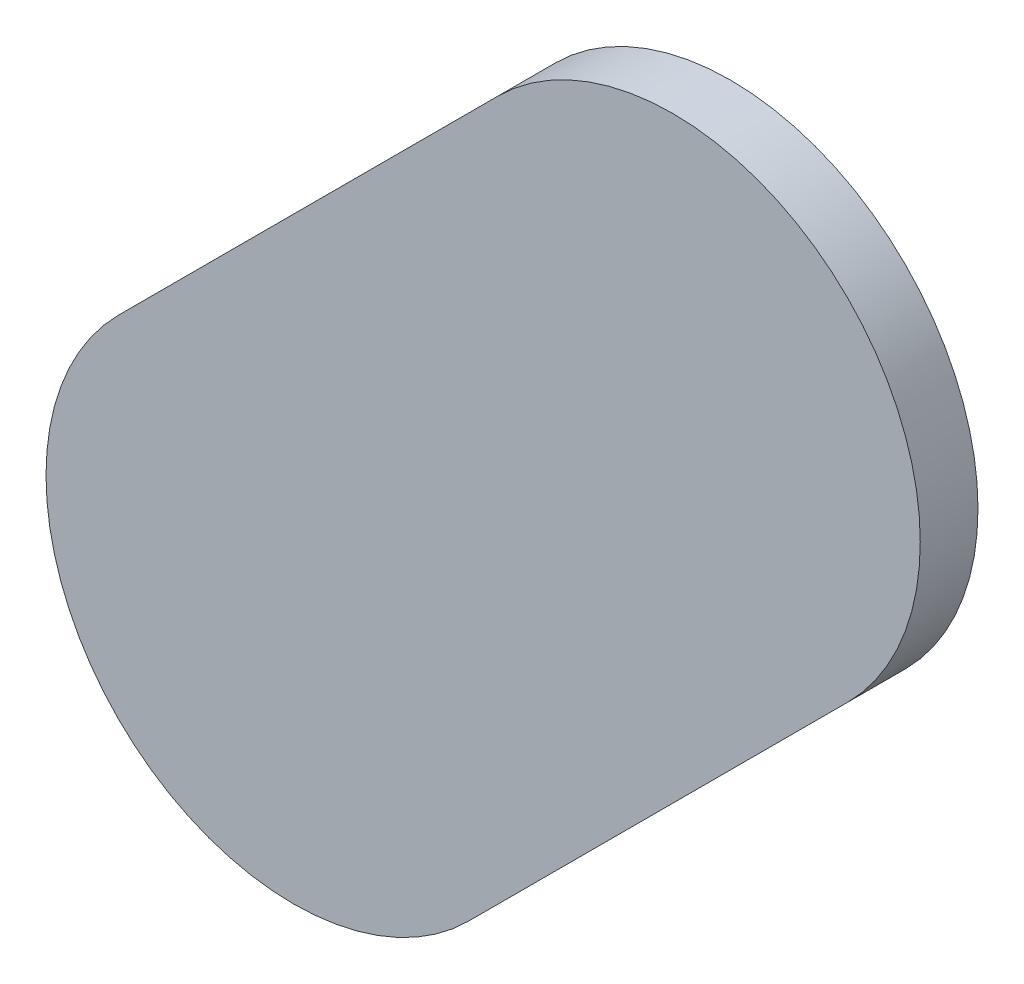
ISO-10303-21;
HEADER;
FILE_DESCRIPTION(('STEP AP214'),'2;1');
FILE_NAME('part.step','',(''),(''),'','','');
FILE_SCHEMA(('AUTOMOTIVE_DESIGN { 1 0 10303 214 1 1 1 1 }'));
ENDSEC;
DATA;
#1=APPLICATION_CONTEXT('core data for automotive mechanical design processes');
#2=APPLICATION_PROTOCOL_DEFINITION('international standard','automotive_design',2000,#1);
#3=PRODUCT_CONTEXT('',#1,'mechanical');
#4=PRODUCT('Part','Part','',(#3));
#5=PRODUCT_RELATED_PRODUCT_CATEGORY('part','',(#4));
#6=PRODUCT_DEFINITION_FORMATION('','',#4);
#7=PRODUCT_DEFINITION_CONTEXT('part definition',#1,'design');
#8=PRODUCT_DEFINITION('design','',#6,#7);
#9=PRODUCT_DEFINITION_SHAPE('','',#8);
#10=(LENGTH_UNIT() NAMED_UNIT(*) SI_UNIT(.MILLI.,.METRE.));
#11=(NAMED_UNIT(*) PLANE_ANGLE_UNIT() SI_UNIT($,.RADIAN.));
#12=(NAMED_UNIT(*) SI_UNIT($,.STERADIAN.) SOLID_ANGLE_UNIT());
#13=UNCERTAINTY_MEASURE_WITH_UNIT(LENGTH_MEASURE(1.E-05),#10,'distance_accuracy_value','');
#14=(GEOMETRIC_REPRESENTATION_CONTEXT(3) GLOBAL_UNCERTAINTY_ASSIGNED_CONTEXT((#13)) GLOBAL_UNIT_ASSIGNED_CONTEXT((#10,
#11,#12)) REPRESENTATION_CONTEXT('',''));
#15=CARTESIAN_POINT('',(0.,0.,0.));
#16=DIRECTION('',(0.,0.,1.));
#17=DIRECTION('',(1.,0.,0.));
#18=AXIS2_PLACEMENT_3D('',#15,#16,#17);
#19=CARTESIAN_POINT('',(132.486066,-63.106066,1.635));
#20=DIRECTION('',(0.,0.,1.));
#21=DIRECTION('',(1.,0.,0.));
#22=AXIS2_PLACEMENT_3D('',#19,#20,#21);
#23=PLANE('',#22);
#24=DIRECTION('',(0.707106781186548,0.707106781186548,0.));
#25=VECTOR('',#24,1.);
#26=CARTESIAN_POINT('',(132.486066,-63.106066,1.635));
#27=LINE('',#26,#25);
#28=CARTESIAN_POINT('',(132.486066,-63.106066,1.635));
#29=VERTEX_POINT('',#28);
#30=CARTESIAN_POINT('',(132.716066,-62.876066,1.635));
#31=VERTEX_POINT('',#30);
#32=EDGE_CURVE('E83',#29,#31,#27,.T.);
#33=ORIENTED_EDGE('',*,*,#32,.T.);
#34=CARTESIAN_POINT('',(132.6099995,-62.7699995,1.635));
#35=DIRECTION('',(0.,0.,1.));
#36=DIRECTION('',(0.707106781186548,-0.707106781186548,0.));
#37=AXIS2_PLACEMENT_3D('',#34,#35,#36);
#38=CIRCLE('',#37,0.150000682813);
#39=CARTESIAN_POINT('',(132.503933,-62.663933,1.635));
#40=VERTEX_POINT('',#39);
#41=EDGE_CURVE('E106',#31,#40,#38,.T.);
#42=ORIENTED_EDGE('',*,*,#41,.T.);
#43=DIRECTION('',(-0.707106781186548,-0.707106781186548,0.));
#44=VECTOR('',#43,1.);
#45=CARTESIAN_POINT('',(132.503933,-62.663933,1.635));
#46=LINE('',#45,#44);
#47=CARTESIAN_POINT('',(132.273933,-62.893933,1.635));
#48=VERTEX_POINT('',#47);
#49=EDGE_CURVE('E76',#40,#48,#46,.T.);
#50=ORIENTED_EDGE('',*,*,#49,.T.);
#51=CARTESIAN_POINT('',(132.3799995,-62.9999995,1.635));
#52=DIRECTION('',(0.,0.,1.));
#53=DIRECTION('',(-0.707106781186548,0.707106781186548,0.));
#54=AXIS2_PLACEMENT_3D('',#51,#52,#53);
#55=CIRCLE('',#54,0.150000682813);
#56=EDGE_CURVE('E11',#48,#29,#55,.T.);
#57=ORIENTED_EDGE('',*,*,#56,.T.);
#58=EDGE_LOOP('',(#33,#42,#50,#57));
#59=FACE_BOUND('',#58,.T.);
#60=ADVANCED_FACE('F17',(#59),#23,.T.);
#61=CARTESIAN_POINT('',(132.486066,-63.106066,1.6));
#62=DIRECTION('',(0.,0.,1.));
#63=DIRECTION('',(1.,0.,0.));
#64=AXIS2_PLACEMENT_3D('',#61,#62,#63);
#65=PLANE('',#64);
#66=CARTESIAN_POINT('',(132.3799995,-62.9999995,1.6));
#67=DIRECTION('',(0.,0.,1.));
#68=DIRECTION('',(-0.707106781186548,0.707106781186548,0.));
#69=AXIS2_PLACEMENT_3D('',#66,#67,#68);
#70=CIRCLE('',#69,0.150000682813);
#71=CARTESIAN_POINT('',(132.273933,-62.893933,1.6));
#72=VERTEX_POINT('',#71);
#73=CARTESIAN_POINT('',(132.486066,-63.106066,1.6));
#74=VERTEX_POINT('',#73);
#75=EDGE_CURVE('E21',#72,#74,#70,.T.);
#76=ORIENTED_EDGE('',*,*,#75,.F.);
#77=DIRECTION('',(-0.707106781186548,-0.707106781186548,0.));
#78=VECTOR('',#77,1.);
#79=CARTESIAN_POINT('',(132.503933,-62.663933,1.6));
#80=LINE('',#79,#78);
#81=CARTESIAN_POINT('',(132.503933,-62.663933,1.6));
#82=VERTEX_POINT('',#81);
#83=EDGE_CURVE('E111',#82,#72,#80,.T.);
#84=ORIENTED_EDGE('',*,*,#83,.F.);
#85=CARTESIAN_POINT('',(132.6099995,-62.7699995,1.6));
#86=DIRECTION('',(0.,0.,1.));
#87=DIRECTION('',(0.707106781186548,-0.707106781186548,0.));
#88=AXIS2_PLACEMENT_3D('',#85,#86,#87);
#89=CIRCLE('',#88,0.150000682813);
#90=CARTESIAN_POINT('',(132.716066,-62.876066,1.6));
#91=VERTEX_POINT('',#90);
#92=EDGE_CURVE('E85',#91,#82,#89,.T.);
#93=ORIENTED_EDGE('',*,*,#92,.F.);
#94=DIRECTION('',(0.707106781186548,0.707106781186548,0.));
#95=VECTOR('',#94,1.);
#96=CARTESIAN_POINT('',(132.486066,-63.106066,1.6));
#97=LINE('',#96,#95);
#98=EDGE_CURVE('E81',#74,#91,#97,.T.);
#99=ORIENTED_EDGE('',*,*,#98,.F.);
#100=EDGE_LOOP('',(#76,#84,#93,#99));
#101=FACE_BOUND('',#100,.T.);
#102=ADVANCED_FACE('F19',(#101),#65,.F.);
#103=CARTESIAN_POINT('',(132.3799995,-62.9999995,1.6));
#104=DIRECTION('',(0.,0.,-1.));
#105=DIRECTION('',(-0.707106781186548,0.707106781186548,0.));
#106=AXIS2_PLACEMENT_3D('',#103,#104,#105);
#107=CYLINDRICAL_SURFACE('',#106,0.150000682813);
#108=ORIENTED_EDGE('',*,*,#75,.T.);
#109=DIRECTION('',(0.,0.,1.));
#110=VECTOR('',#109,1.);
#111=CARTESIAN_POINT('',(132.486066,-63.106066,1.6));
#112=LINE('',#111,#110);
#113=EDGE_CURVE('E70',#74,#29,#112,.T.);
#114=ORIENTED_EDGE('',*,*,#113,.T.);
#115=ORIENTED_EDGE('',*,*,#56,.F.);
#116=DIRECTION('',(0.,0.,1.));
#117=VECTOR('',#116,1.);
#118=CARTESIAN_POINT('',(132.273933,-62.893933,1.6));
#119=LINE('',#118,#117);
#120=EDGE_CURVE('E73',#72,#48,#119,.T.);
#121=ORIENTED_EDGE('',*,*,#120,.F.);
#122=EDGE_LOOP('',(#108,#114,#115,#121));
#123=FACE_BOUND('',#122,.T.);
#124=ADVANCED_FACE('F69',(#123),#107,.T.);
#125=CARTESIAN_POINT('',(132.503933,-62.663933,1.6));
#126=DIRECTION('',(0.707106781186548,-0.707106781186548,0.));
#127=DIRECTION('',(0.,0.,-1.));
#128=AXIS2_PLACEMENT_3D('',#125,#126,#127);
#129=PLANE('',#128);
#130=ORIENTED_EDGE('',*,*,#83,.T.);
#131=ORIENTED_EDGE('',*,*,#120,.T.);
#132=ORIENTED_EDGE('',*,*,#49,.F.);
#133=DIRECTION('',(0.,0.,1.));
#134=VECTOR('',#133,1.);
#135=CARTESIAN_POINT('',(132.503933,-62.663933,1.6));
#136=LINE('',#135,#134);
#137=EDGE_CURVE('E101',#82,#40,#136,.T.);
#138=ORIENTED_EDGE('',*,*,#137,.F.);
#139=EDGE_LOOP('',(#130,#131,#132,#138));
#140=FACE_BOUND('',#139,.T.);
#141=ADVANCED_FACE('F117',(#140),#129,.F.);
#142=CARTESIAN_POINT('',(132.6099995,-62.7699995,1.6));
#143=DIRECTION('',(0.,0.,-1.));
#144=DIRECTION('',(0.707106781186548,-0.707106781186548,0.));
#145=AXIS2_PLACEMENT_3D('',#142,#143,#144);
#146=CYLINDRICAL_SURFACE('',#145,0.150000682813);
#147=ORIENTED_EDGE('',*,*,#92,.T.);
#148=ORIENTED_EDGE('',*,*,#137,.T.);
#149=ORIENTED_EDGE('',*,*,#41,.F.);
#150=DIRECTION('',(0.,0.,1.));
#151=VECTOR('',#150,1.);
#152=CARTESIAN_POINT('',(132.716066,-62.876066,1.6));
#153=LINE('',#152,#151);
#154=EDGE_CURVE('E90',#91,#31,#153,.T.);
#155=ORIENTED_EDGE('',*,*,#154,.F.);
#156=EDGE_LOOP('',(#147,#148,#149,#155));
#157=FACE_BOUND('',#156,.T.);
#158=ADVANCED_FACE('F120',(#157),#146,.T.);
#159=CARTESIAN_POINT('',(132.486066,-63.106066,1.6));
#160=DIRECTION('',(-0.707106781186548,0.707106781186548,0.));
#161=DIRECTION('',(0.,0.,1.));
#162=AXIS2_PLACEMENT_3D('',#159,#160,#161);
#163=PLANE('',#162);
#164=ORIENTED_EDGE('',*,*,#98,.T.);
#165=ORIENTED_EDGE('',*,*,#154,.T.);
#166=ORIENTED_EDGE('',*,*,#32,.F.);
#167=ORIENTED_EDGE('',*,*,#113,.F.);
#168=EDGE_LOOP('',(#164,#165,#166,#167));
#169=FACE_BOUND('',#168,.T.);
#170=ADVANCED_FACE('F79',(#169),#163,.F.);
#171=CLOSED_SHELL('',(#60,#102,#124,#141,#158,#170));
#172=MANIFOLD_SOLID_BREP('B1',#171);
#173=ADVANCED_BREP_SHAPE_REPRESENTATION('',(#18,#172),#14);
#174=SHAPE_DEFINITION_REPRESENTATION(#9,#173);
ENDSEC;
END-ISO-10303-21;
